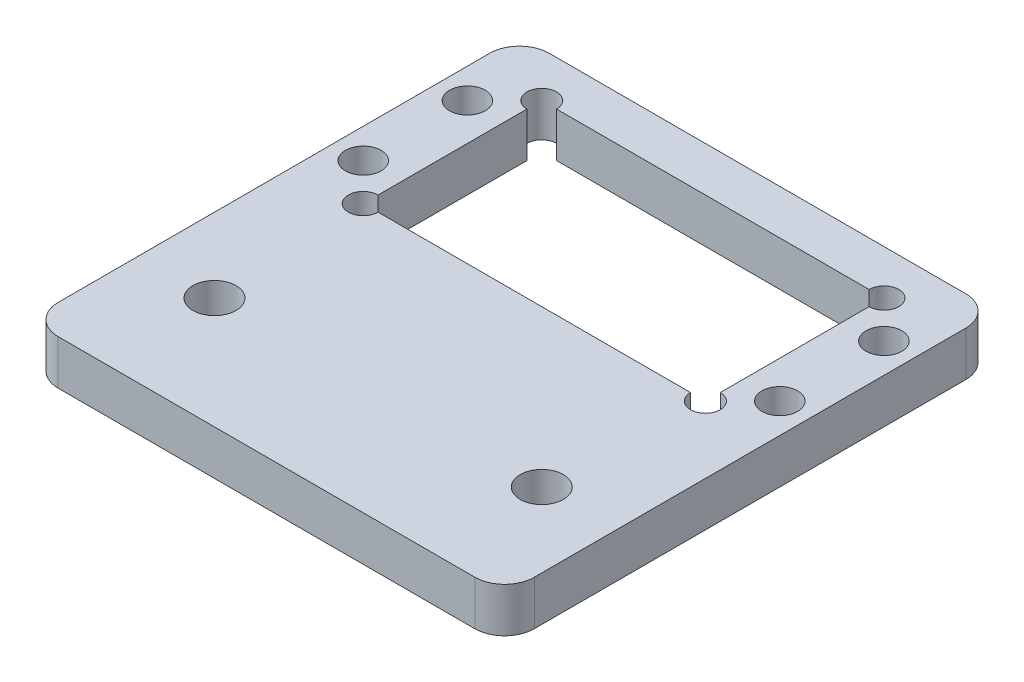
ISO-10303-21;
HEADER;
FILE_DESCRIPTION(('STEP AP214'),'2;1');
FILE_NAME('part.step','',(''),(''),'','','');
FILE_SCHEMA(('AUTOMOTIVE_DESIGN { 1 0 10303 214 1 1 1 1 }'));
ENDSEC;
DATA;
#1=APPLICATION_CONTEXT('core data for automotive mechanical design processes');
#2=APPLICATION_PROTOCOL_DEFINITION('international standard','automotive_design',2000,#1);
#3=PRODUCT_CONTEXT('',#1,'mechanical');
#4=PRODUCT('Part','Part','',(#3));
#5=PRODUCT_RELATED_PRODUCT_CATEGORY('part','',(#4));
#6=PRODUCT_DEFINITION_FORMATION('','',#4);
#7=PRODUCT_DEFINITION_CONTEXT('part definition',#1,'design');
#8=PRODUCT_DEFINITION('design','',#6,#7);
#9=PRODUCT_DEFINITION_SHAPE('','',#8);
#10=(LENGTH_UNIT() NAMED_UNIT(*) SI_UNIT(.MILLI.,.METRE.));
#11=(NAMED_UNIT(*) PLANE_ANGLE_UNIT() SI_UNIT($,.RADIAN.));
#12=(NAMED_UNIT(*) SI_UNIT($,.STERADIAN.) SOLID_ANGLE_UNIT());
#13=UNCERTAINTY_MEASURE_WITH_UNIT(LENGTH_MEASURE(1.E-05),#10,'distance_accuracy_value','');
#14=(GEOMETRIC_REPRESENTATION_CONTEXT(3) GLOBAL_UNCERTAINTY_ASSIGNED_CONTEXT((#13)) GLOBAL_UNIT_ASSIGNED_CONTEXT((#10,
#11,#12)) REPRESENTATION_CONTEXT('',''));
#15=CARTESIAN_POINT('',(0.,0.,0.));
#16=DIRECTION('',(0.,0.,1.));
#17=DIRECTION('',(1.,0.,0.));
#18=AXIS2_PLACEMENT_3D('',#15,#16,#17);
#19=CARTESIAN_POINT('',(0.,3.,0.));
#20=DIRECTION('',(0.,-1.,0.));
#21=DIRECTION('',(0.,0.,-1.));
#22=AXIS2_PLACEMENT_3D('',#19,#20,#21);
#23=PLANE('',#22);
#24=CARTESIAN_POINT('',(14.,3.,3.5));
#25=DIRECTION('',(0.,1.,0.));
#26=DIRECTION('',(0.,0.,1.));
#27=AXIS2_PLACEMENT_3D('',#24,#25,#26);
#28=CIRCLE('',#27,1.2);
#29=CARTESIAN_POINT('',(14.,3.,4.7));
#30=VERTEX_POINT('',#29);
#31=EDGE_CURVE('E214',#30,#30,#28,.T.);
#32=ORIENTED_EDGE('',*,*,#31,.F.);
#33=EDGE_LOOP('',(#32));
#34=FACE_BOUND('',#33,.T.);
#35=CARTESIAN_POINT('',(14.,3.,-3.5));
#36=DIRECTION('',(0.,1.,0.));
#37=DIRECTION('',(0.,0.,1.));
#38=AXIS2_PLACEMENT_3D('',#35,#36,#37);
#39=CIRCLE('',#38,1.2);
#40=CARTESIAN_POINT('',(14.,3.,-2.3));
#41=VERTEX_POINT('',#40);
#42=EDGE_CURVE('E222',#41,#41,#39,.T.);
#43=ORIENTED_EDGE('',*,*,#42,.F.);
#44=EDGE_LOOP('',(#43));
#45=FACE_BOUND('',#44,.T.);
#46=CARTESIAN_POINT('',(-14.,3.,3.5));
#47=DIRECTION('',(0.,1.,0.));
#48=DIRECTION('',(0.,0.,1.));
#49=AXIS2_PLACEMENT_3D('',#46,#47,#48);
#50=CIRCLE('',#49,1.2);
#51=CARTESIAN_POINT('',(-14.,3.,4.7));
#52=VERTEX_POINT('',#51);
#53=EDGE_CURVE('E230',#52,#52,#50,.T.);
#54=ORIENTED_EDGE('',*,*,#53,.F.);
#55=EDGE_LOOP('',(#54));
#56=FACE_BOUND('',#55,.T.);
#57=CARTESIAN_POINT('',(-14.,3.,-3.5));
#58=DIRECTION('',(0.,1.,0.));
#59=DIRECTION('',(0.,0.,1.));
#60=AXIS2_PLACEMENT_3D('',#57,#58,#59);
#61=CIRCLE('',#60,1.2);
#62=CARTESIAN_POINT('',(-14.,3.,-2.3));
#63=VERTEX_POINT('',#62);
#64=EDGE_CURVE('E238',#63,#63,#61,.T.);
#65=ORIENTED_EDGE('',*,*,#64,.F.);
#66=EDGE_LOOP('',(#65));
#67=FACE_BOUND('',#66,.T.);
#68=DIRECTION('',(0.,0.,-1.));
#69=VECTOR('',#68,1.);
#70=CARTESIAN_POINT('',(16.,3.,9.));
#71=LINE('',#70,#69);
#72=CARTESIAN_POINT('',(16.,3.,22.));
#73=VERTEX_POINT('',#72);
#74=CARTESIAN_POINT('',(16.,3.,-7.));
#75=VERTEX_POINT('',#74);
#76=EDGE_CURVE('E246',#73,#75,#71,.T.);
#77=ORIENTED_EDGE('',*,*,#76,.T.);
#78=CARTESIAN_POINT('',(14.,3.,-7.));
#79=DIRECTION('',(0.,-1.,0.));
#80=DIRECTION('',(0.,0.,-1.));
#81=AXIS2_PLACEMENT_3D('',#78,#79,#80);
#82=CIRCLE('',#81,2.);
#83=CARTESIAN_POINT('',(14.,3.,-9.));
#84=VERTEX_POINT('',#83);
#85=EDGE_CURVE('E300',#75,#84,#82,.F.);
#86=ORIENTED_EDGE('',*,*,#85,.T.);
#87=DIRECTION('',(-1.,0.,0.));
#88=VECTOR('',#87,1.);
#89=CARTESIAN_POINT('',(-16.,3.,-9.));
#90=LINE('',#89,#88);
#91=CARTESIAN_POINT('',(-14.,3.,-9.));
#92=VERTEX_POINT('',#91);
#93=EDGE_CURVE('E250',#84,#92,#90,.T.);
#94=ORIENTED_EDGE('',*,*,#93,.T.);
#95=CARTESIAN_POINT('',(-14.,3.,-7.));
#96=DIRECTION('',(0.,-1.,0.));
#97=DIRECTION('',(0.,0.,-1.));
#98=AXIS2_PLACEMENT_3D('',#95,#96,#97);
#99=CIRCLE('',#98,2.);
#100=CARTESIAN_POINT('',(-16.,3.,-7.));
#101=VERTEX_POINT('',#100);
#102=EDGE_CURVE('E297',#92,#101,#99,.F.);
#103=ORIENTED_EDGE('',*,*,#102,.T.);
#104=DIRECTION('',(0.,0.,1.));
#105=VECTOR('',#104,1.);
#106=CARTESIAN_POINT('',(-16.,3.,9.));
#107=LINE('',#106,#105);
#108=CARTESIAN_POINT('',(-16.,3.,22.));
#109=VERTEX_POINT('',#108);
#110=EDGE_CURVE('E255',#101,#109,#107,.T.);
#111=ORIENTED_EDGE('',*,*,#110,.T.);
#112=CARTESIAN_POINT('',(-14.,3.,22.));
#113=DIRECTION('',(0.,-1.,0.));
#114=DIRECTION('',(0.,0.,-1.));
#115=AXIS2_PLACEMENT_3D('',#112,#113,#114);
#116=CIRCLE('',#115,2.);
#117=CARTESIAN_POINT('',(-14.,3.,24.));
#118=VERTEX_POINT('',#117);
#119=EDGE_CURVE('E67',#109,#118,#116,.F.);
#120=ORIENTED_EDGE('',*,*,#119,.T.);
#121=DIRECTION('',(1.,0.,0.));
#122=VECTOR('',#121,1.);
#123=CARTESIAN_POINT('',(-16.,3.,24.));
#124=LINE('',#123,#122);
#125=CARTESIAN_POINT('',(14.,3.,24.));
#126=VERTEX_POINT('',#125);
#127=EDGE_CURVE('E314',#118,#126,#124,.T.);
#128=ORIENTED_EDGE('',*,*,#127,.T.);
#129=CARTESIAN_POINT('',(14.,3.,22.));
#130=DIRECTION('',(0.,-1.,0.));
#131=DIRECTION('',(0.,0.,-1.));
#132=AXIS2_PLACEMENT_3D('',#129,#130,#131);
#133=CIRCLE('',#132,2.);
#134=EDGE_CURVE('E59',#126,#73,#133,.F.);
#135=ORIENTED_EDGE('',*,*,#134,.T.);
#136=EDGE_LOOP('',(#77,#86,#94,#103,#111,#120,#128,#135));
#137=FACE_BOUND('',#136,.T.);
#138=DIRECTION('',(-1.,0.,0.));
#139=VECTOR('',#138,1.);
#140=CARTESIAN_POINT('',(-11.5,3.,-6.));
#141=LINE('',#140,#139);
#142=CARTESIAN_POINT('',(10.5,3.,-6.));
#143=VERTEX_POINT('',#142);
#144=CARTESIAN_POINT('',(-10.5,3.,-6.));
#145=VERTEX_POINT('',#144);
#146=EDGE_CURVE('E187',#143,#145,#141,.T.);
#147=ORIENTED_EDGE('',*,*,#146,.F.);
#148=CARTESIAN_POINT('',(11.5,3.,-6.));
#149=DIRECTION('',(0.,1.,0.));
#150=DIRECTION('',(0.,0.,1.));
#151=AXIS2_PLACEMENT_3D('',#148,#149,#150);
#152=CIRCLE('',#151,1.);
#153=CARTESIAN_POINT('',(11.5,3.,-5.));
#154=VERTEX_POINT('',#153);
#155=EDGE_CURVE('E355',#154,#143,#152,.T.);
#156=ORIENTED_EDGE('',*,*,#155,.F.);
#157=DIRECTION('',(0.,0.,-1.));
#158=VECTOR('',#157,1.);
#159=CARTESIAN_POINT('',(11.5,3.,6.));
#160=LINE('',#159,#158);
#161=CARTESIAN_POINT('',(11.5,3.,5.));
#162=VERTEX_POINT('',#161);
#163=EDGE_CURVE('E194',#162,#154,#160,.T.);
#164=ORIENTED_EDGE('',*,*,#163,.F.);
#165=CARTESIAN_POINT('',(11.5,3.,6.));
#166=DIRECTION('',(0.,1.,0.));
#167=DIRECTION('',(0.,0.,1.));
#168=AXIS2_PLACEMENT_3D('',#165,#166,#167);
#169=CIRCLE('',#168,1.);
#170=CARTESIAN_POINT('',(10.5,3.,6.));
#171=VERTEX_POINT('',#170);
#172=EDGE_CURVE('E341',#171,#162,#169,.T.);
#173=ORIENTED_EDGE('',*,*,#172,.F.);
#174=DIRECTION('',(1.,0.,0.));
#175=VECTOR('',#174,1.);
#176=CARTESIAN_POINT('',(-11.5,3.,6.));
#177=LINE('',#176,#175);
#178=CARTESIAN_POINT('',(-10.5,3.,6.));
#179=VERTEX_POINT('',#178);
#180=EDGE_CURVE('E180',#179,#171,#177,.T.);
#181=ORIENTED_EDGE('',*,*,#180,.F.);
#182=CARTESIAN_POINT('',(-11.5,3.,6.));
#183=DIRECTION('',(0.,1.,0.));
#184=DIRECTION('',(0.,0.,1.));
#185=AXIS2_PLACEMENT_3D('',#182,#183,#184);
#186=CIRCLE('',#185,1.);
#187=CARTESIAN_POINT('',(-11.5,3.,5.));
#188=VERTEX_POINT('',#187);
#189=EDGE_CURVE('E160',#188,#179,#186,.T.);
#190=ORIENTED_EDGE('',*,*,#189,.F.);
#191=DIRECTION('',(0.,0.,1.));
#192=VECTOR('',#191,1.);
#193=CARTESIAN_POINT('',(-11.5,3.,6.));
#194=LINE('',#193,#192);
#195=CARTESIAN_POINT('',(-11.5,3.,-5.));
#196=VERTEX_POINT('',#195);
#197=EDGE_CURVE('E177',#196,#188,#194,.T.);
#198=ORIENTED_EDGE('',*,*,#197,.F.);
#199=CARTESIAN_POINT('',(-11.5,3.,-6.));
#200=DIRECTION('',(0.,1.,0.));
#201=DIRECTION('',(0.,0.,1.));
#202=AXIS2_PLACEMENT_3D('',#199,#200,#201);
#203=CIRCLE('',#202,1.);
#204=EDGE_CURVE('E371',#145,#196,#203,.T.);
#205=ORIENTED_EDGE('',*,*,#204,.F.);
#206=EDGE_LOOP('',(#147,#156,#164,#173,#181,#190,#198,#205));
#207=FACE_BOUND('',#206,.T.);
#208=CARTESIAN_POINT('',(11.,3.,16.5));
#209=DIRECTION('',(0.,1.,0.));
#210=DIRECTION('',(0.,0.,1.));
#211=AXIS2_PLACEMENT_3D('',#208,#209,#210);
#212=CIRCLE('',#211,1.45);
#213=CARTESIAN_POINT('',(11.,3.,17.95));
#214=VERTEX_POINT('',#213);
#215=EDGE_CURVE('E479',#214,#214,#212,.T.);
#216=ORIENTED_EDGE('',*,*,#215,.F.);
#217=EDGE_LOOP('',(#216));
#218=FACE_BOUND('',#217,.T.);
#219=CARTESIAN_POINT('',(-11.,3.,16.5));
#220=DIRECTION('',(0.,1.,0.));
#221=DIRECTION('',(0.,0.,1.));
#222=AXIS2_PLACEMENT_3D('',#219,#220,#221);
#223=CIRCLE('',#222,1.45);
#224=CARTESIAN_POINT('',(-11.,3.,17.95));
#225=VERTEX_POINT('',#224);
#226=EDGE_CURVE('E328',#225,#225,#223,.T.);
#227=ORIENTED_EDGE('',*,*,#226,.F.);
#228=EDGE_LOOP('',(#227));
#229=FACE_BOUND('',#228,.T.);
#230=ADVANCED_FACE('F43',(#34,#45,#56,#67,#137,#207,#218,#229),#23,.F.);
#231=CARTESIAN_POINT('',(0.,0.,0.));
#232=DIRECTION('',(0.,-1.,0.));
#233=DIRECTION('',(0.,0.,-1.));
#234=AXIS2_PLACEMENT_3D('',#231,#232,#233);
#235=PLANE('',#234);
#236=CARTESIAN_POINT('',(11.5,0.,-6.));
#237=DIRECTION('',(0.,-1.,0.));
#238=DIRECTION('',(0.,0.,-1.));
#239=AXIS2_PLACEMENT_3D('',#236,#237,#238);
#240=CIRCLE('',#239,1.);
#241=CARTESIAN_POINT('',(11.5,0.,-5.));
#242=VERTEX_POINT('',#241);
#243=CARTESIAN_POINT('',(10.5,0.,-6.));
#244=VERTEX_POINT('',#243);
#245=EDGE_CURVE('E325',#242,#244,#240,.F.);
#246=ORIENTED_EDGE('',*,*,#245,.T.);
#247=DIRECTION('',(-1.,0.,0.));
#248=VECTOR('',#247,1.);
#249=CARTESIAN_POINT('',(-11.5,0.,-6.));
#250=LINE('',#249,#248);
#251=CARTESIAN_POINT('',(-10.5,0.,-6.));
#252=VERTEX_POINT('',#251);
#253=EDGE_CURVE('E202',#244,#252,#250,.T.);
#254=ORIENTED_EDGE('',*,*,#253,.T.);
#255=CARTESIAN_POINT('',(-11.5,0.,-6.));
#256=DIRECTION('',(0.,-1.,0.));
#257=DIRECTION('',(0.,0.,-1.));
#258=AXIS2_PLACEMENT_3D('',#255,#256,#257);
#259=CIRCLE('',#258,1.);
#260=CARTESIAN_POINT('',(-11.5,0.,-5.));
#261=VERTEX_POINT('',#260);
#262=EDGE_CURVE('E203',#252,#261,#259,.F.);
#263=ORIENTED_EDGE('',*,*,#262,.T.);
#264=DIRECTION('',(0.,0.,1.));
#265=VECTOR('',#264,1.);
#266=CARTESIAN_POINT('',(-11.5,0.,6.));
#267=LINE('',#266,#265);
#268=CARTESIAN_POINT('',(-11.5,0.,5.));
#269=VERTEX_POINT('',#268);
#270=EDGE_CURVE('E207',#261,#269,#267,.T.);
#271=ORIENTED_EDGE('',*,*,#270,.T.);
#272=CARTESIAN_POINT('',(-11.5,0.,6.));
#273=DIRECTION('',(0.,-1.,0.));
#274=DIRECTION('',(0.,0.,-1.));
#275=AXIS2_PLACEMENT_3D('',#272,#273,#274);
#276=CIRCLE('',#275,1.);
#277=CARTESIAN_POINT('',(-10.5,0.,6.));
#278=VERTEX_POINT('',#277);
#279=EDGE_CURVE('E163',#269,#278,#276,.F.);
#280=ORIENTED_EDGE('',*,*,#279,.T.);
#281=DIRECTION('',(1.,0.,0.));
#282=VECTOR('',#281,1.);
#283=CARTESIAN_POINT('',(-11.5,0.,6.));
#284=LINE('',#283,#282);
#285=CARTESIAN_POINT('',(10.5,0.,6.));
#286=VERTEX_POINT('',#285);
#287=EDGE_CURVE('E210',#278,#286,#284,.T.);
#288=ORIENTED_EDGE('',*,*,#287,.T.);
#289=CARTESIAN_POINT('',(11.5,0.,6.));
#290=DIRECTION('',(0.,-1.,0.));
#291=DIRECTION('',(0.,0.,-1.));
#292=AXIS2_PLACEMENT_3D('',#289,#290,#291);
#293=CIRCLE('',#292,1.);
#294=CARTESIAN_POINT('',(11.5,0.,5.));
#295=VERTEX_POINT('',#294);
#296=EDGE_CURVE('E337',#286,#295,#293,.F.);
#297=ORIENTED_EDGE('',*,*,#296,.T.);
#298=DIRECTION('',(0.,0.,-1.));
#299=VECTOR('',#298,1.);
#300=CARTESIAN_POINT('',(11.5,0.,6.));
#301=LINE('',#300,#299);
#302=EDGE_CURVE('E198',#295,#242,#301,.T.);
#303=ORIENTED_EDGE('',*,*,#302,.T.);
#304=EDGE_LOOP('',(#246,#254,#263,#271,#280,#288,#297,#303));
#305=FACE_BOUND('',#304,.T.);
#306=CARTESIAN_POINT('',(14.,0.,-3.5));
#307=DIRECTION('',(0.,1.,0.));
#308=DIRECTION('',(0.,0.,1.));
#309=AXIS2_PLACEMENT_3D('',#306,#307,#308);
#310=CIRCLE('',#309,1.2);
#311=CARTESIAN_POINT('',(14.,0.,-2.3));
#312=VERTEX_POINT('',#311);
#313=EDGE_CURVE('E218',#312,#312,#310,.T.);
#314=ORIENTED_EDGE('',*,*,#313,.T.);
#315=EDGE_LOOP('',(#314));
#316=FACE_BOUND('',#315,.T.);
#317=CARTESIAN_POINT('',(-14.,0.,-3.5));
#318=DIRECTION('',(0.,1.,0.));
#319=DIRECTION('',(0.,0.,1.));
#320=AXIS2_PLACEMENT_3D('',#317,#318,#319);
#321=CIRCLE('',#320,1.2);
#322=CARTESIAN_POINT('',(-14.,0.,-2.3));
#323=VERTEX_POINT('',#322);
#324=EDGE_CURVE('E234',#323,#323,#321,.T.);
#325=ORIENTED_EDGE('',*,*,#324,.T.);
#326=EDGE_LOOP('',(#325));
#327=FACE_BOUND('',#326,.T.);
#328=DIRECTION('',(-1.,0.,0.));
#329=VECTOR('',#328,1.);
#330=CARTESIAN_POINT('',(-16.,0.,-9.));
#331=LINE('',#330,#329);
#332=CARTESIAN_POINT('',(14.,0.,-9.));
#333=VERTEX_POINT('',#332);
#334=CARTESIAN_POINT('',(-14.,0.,-9.));
#335=VERTEX_POINT('',#334);
#336=EDGE_CURVE('E262',#333,#335,#331,.T.);
#337=ORIENTED_EDGE('',*,*,#336,.F.);
#338=CARTESIAN_POINT('',(14.,0.,-7.));
#339=DIRECTION('',(0.,-1.,0.));
#340=DIRECTION('',(0.,0.,-1.));
#341=AXIS2_PLACEMENT_3D('',#338,#339,#340);
#342=CIRCLE('',#341,2.);
#343=CARTESIAN_POINT('',(16.,0.,-7.));
#344=VERTEX_POINT('',#343);
#345=EDGE_CURVE('E284',#333,#344,#342,.T.);
#346=ORIENTED_EDGE('',*,*,#345,.T.);
#347=DIRECTION('',(0.,0.,-1.));
#348=VECTOR('',#347,1.);
#349=CARTESIAN_POINT('',(16.,0.,9.));
#350=LINE('',#349,#348);
#351=CARTESIAN_POINT('',(16.,0.,22.));
#352=VERTEX_POINT('',#351);
#353=EDGE_CURVE('E242',#352,#344,#350,.T.);
#354=ORIENTED_EDGE('',*,*,#353,.F.);
#355=CARTESIAN_POINT('',(14.,0.,22.));
#356=DIRECTION('',(0.,-1.,0.));
#357=DIRECTION('',(0.,0.,-1.));
#358=AXIS2_PLACEMENT_3D('',#355,#356,#357);
#359=CIRCLE('',#358,2.);
#360=CARTESIAN_POINT('',(14.,0.,24.));
#361=VERTEX_POINT('',#360);
#362=EDGE_CURVE('E275',#352,#361,#359,.T.);
#363=ORIENTED_EDGE('',*,*,#362,.T.);
#364=DIRECTION('',(1.,0.,0.));
#365=VECTOR('',#364,1.);
#366=CARTESIAN_POINT('',(-16.,0.,24.));
#367=LINE('',#366,#365);
#368=CARTESIAN_POINT('',(-14.,0.,24.));
#369=VERTEX_POINT('',#368);
#370=EDGE_CURVE('E317',#369,#361,#367,.T.);
#371=ORIENTED_EDGE('',*,*,#370,.F.);
#372=CARTESIAN_POINT('',(-14.,0.,22.));
#373=DIRECTION('',(0.,-1.,0.));
#374=DIRECTION('',(0.,0.,-1.));
#375=AXIS2_PLACEMENT_3D('',#372,#373,#374);
#376=CIRCLE('',#375,2.);
#377=CARTESIAN_POINT('',(-16.,0.,22.));
#378=VERTEX_POINT('',#377);
#379=EDGE_CURVE('E278',#369,#378,#376,.T.);
#380=ORIENTED_EDGE('',*,*,#379,.T.);
#381=DIRECTION('',(0.,0.,1.));
#382=VECTOR('',#381,1.);
#383=CARTESIAN_POINT('',(-16.,0.,9.));
#384=LINE('',#383,#382);
#385=CARTESIAN_POINT('',(-16.,0.,-7.));
#386=VERTEX_POINT('',#385);
#387=EDGE_CURVE('E251',#386,#378,#384,.T.);
#388=ORIENTED_EDGE('',*,*,#387,.F.);
#389=CARTESIAN_POINT('',(-14.,0.,-7.));
#390=DIRECTION('',(0.,-1.,0.));
#391=DIRECTION('',(0.,0.,-1.));
#392=AXIS2_PLACEMENT_3D('',#389,#390,#391);
#393=CIRCLE('',#392,2.);
#394=EDGE_CURVE('E281',#386,#335,#393,.T.);
#395=ORIENTED_EDGE('',*,*,#394,.T.);
#396=EDGE_LOOP('',(#337,#346,#354,#363,#371,#380,#388,#395));
#397=FACE_BOUND('',#396,.T.);
#398=CARTESIAN_POINT('',(-14.,0.,3.5));
#399=DIRECTION('',(0.,1.,0.));
#400=DIRECTION('',(0.,0.,1.));
#401=AXIS2_PLACEMENT_3D('',#398,#399,#400);
#402=CIRCLE('',#401,1.2);
#403=CARTESIAN_POINT('',(-14.,0.,4.7));
#404=VERTEX_POINT('',#403);
#405=EDGE_CURVE('E226',#404,#404,#402,.T.);
#406=ORIENTED_EDGE('',*,*,#405,.T.);
#407=EDGE_LOOP('',(#406));
#408=FACE_BOUND('',#407,.T.);
#409=CARTESIAN_POINT('',(14.,0.,3.5));
#410=DIRECTION('',(0.,1.,0.));
#411=DIRECTION('',(0.,0.,1.));
#412=AXIS2_PLACEMENT_3D('',#409,#410,#411);
#413=CIRCLE('',#412,1.2);
#414=CARTESIAN_POINT('',(14.,0.,4.7));
#415=VERTEX_POINT('',#414);
#416=EDGE_CURVE('E191',#415,#415,#413,.T.);
#417=ORIENTED_EDGE('',*,*,#416,.T.);
#418=EDGE_LOOP('',(#417));
#419=FACE_BOUND('',#418,.T.);
#420=CARTESIAN_POINT('',(11.,0.,16.5));
#421=DIRECTION('',(0.,1.,0.));
#422=DIRECTION('',(0.,0.,1.));
#423=AXIS2_PLACEMENT_3D('',#420,#421,#422);
#424=CIRCLE('',#423,1.45);
#425=CARTESIAN_POINT('',(11.,0.,17.95));
#426=VERTEX_POINT('',#425);
#427=EDGE_CURVE('E467',#426,#426,#424,.T.);
#428=ORIENTED_EDGE('',*,*,#427,.T.);
#429=EDGE_LOOP('',(#428));
#430=FACE_BOUND('',#429,.T.);
#431=CARTESIAN_POINT('',(-11.,0.,16.5));
#432=DIRECTION('',(0.,1.,0.));
#433=DIRECTION('',(0.,0.,1.));
#434=AXIS2_PLACEMENT_3D('',#431,#432,#433);
#435=CIRCLE('',#434,1.45);
#436=CARTESIAN_POINT('',(-11.,0.,17.95));
#437=VERTEX_POINT('',#436);
#438=EDGE_CURVE('E321',#437,#437,#435,.T.);
#439=ORIENTED_EDGE('',*,*,#438,.T.);
#440=EDGE_LOOP('',(#439));
#441=FACE_BOUND('',#440,.T.);
#442=ADVANCED_FACE('F389',(#305,#316,#327,#397,#408,#419,#430,#441),#235,.T.);
#443=CARTESIAN_POINT('',(16.,3.,9.));
#444=DIRECTION('',(-1.,0.,0.));
#445=DIRECTION('',(0.,0.,1.));
#446=AXIS2_PLACEMENT_3D('',#443,#444,#445);
#447=PLANE('',#446);
#448=ORIENTED_EDGE('',*,*,#353,.T.);
#449=DIRECTION('',(0.,-1.,0.));
#450=VECTOR('',#449,1.);
#451=CARTESIAN_POINT('',(16.,3.,-7.));
#452=LINE('',#451,#450);
#453=EDGE_CURVE('E290',#344,#75,#452,.F.);
#454=ORIENTED_EDGE('',*,*,#453,.T.);
#455=ORIENTED_EDGE('',*,*,#76,.F.);
#456=DIRECTION('',(0.,1.,0.));
#457=VECTOR('',#456,1.);
#458=CARTESIAN_POINT('',(16.,0.,22.));
#459=LINE('',#458,#457);
#460=EDGE_CURVE('E287',#73,#352,#459,.F.);
#461=ORIENTED_EDGE('',*,*,#460,.T.);
#462=EDGE_LOOP('',(#448,#454,#455,#461));
#463=FACE_BOUND('',#462,.T.);
#464=ADVANCED_FACE('F412',(#463),#447,.F.);
#465=CARTESIAN_POINT('',(-16.,3.,-9.));
#466=DIRECTION('',(0.,0.,1.));
#467=DIRECTION('',(1.,0.,0.));
#468=AXIS2_PLACEMENT_3D('',#465,#466,#467);
#469=PLANE('',#468);
#470=ORIENTED_EDGE('',*,*,#93,.F.);
#471=DIRECTION('',(0.,-1.,0.));
#472=VECTOR('',#471,1.);
#473=CARTESIAN_POINT('',(14.,3.,-9.));
#474=LINE('',#473,#472);
#475=EDGE_CURVE('E271',#84,#333,#474,.T.);
#476=ORIENTED_EDGE('',*,*,#475,.T.);
#477=ORIENTED_EDGE('',*,*,#336,.T.);
#478=DIRECTION('',(0.,-1.,0.));
#479=VECTOR('',#478,1.);
#480=CARTESIAN_POINT('',(-14.,3.,-9.));
#481=LINE('',#480,#479);
#482=EDGE_CURVE('E258',#335,#92,#481,.F.);
#483=ORIENTED_EDGE('',*,*,#482,.T.);
#484=EDGE_LOOP('',(#470,#476,#477,#483));
#485=FACE_BOUND('',#484,.T.);
#486=ADVANCED_FACE('F423',(#485),#469,.F.);
#487=CARTESIAN_POINT('',(-16.,3.,9.));
#488=DIRECTION('',(1.,0.,0.));
#489=DIRECTION('',(0.,0.,-1.));
#490=AXIS2_PLACEMENT_3D('',#487,#488,#489);
#491=PLANE('',#490);
#492=ORIENTED_EDGE('',*,*,#110,.F.);
#493=DIRECTION('',(0.,-1.,0.));
#494=VECTOR('',#493,1.);
#495=CARTESIAN_POINT('',(-16.,3.,-7.));
#496=LINE('',#495,#494);
#497=EDGE_CURVE('E307',#101,#386,#496,.T.);
#498=ORIENTED_EDGE('',*,*,#497,.T.);
#499=ORIENTED_EDGE('',*,*,#387,.T.);
#500=DIRECTION('',(0.,1.,0.));
#501=VECTOR('',#500,1.);
#502=CARTESIAN_POINT('',(-16.,3.,22.));
#503=LINE('',#502,#501);
#504=EDGE_CURVE('E303',#378,#109,#503,.T.);
#505=ORIENTED_EDGE('',*,*,#504,.T.);
#506=EDGE_LOOP('',(#492,#498,#499,#505));
#507=FACE_BOUND('',#506,.T.);
#508=ADVANCED_FACE('F420',(#507),#491,.F.);
#509=CARTESIAN_POINT('',(-14.,3.,-3.5));
#510=DIRECTION('',(0.,-1.,0.));
#511=DIRECTION('',(0.,0.,-1.));
#512=AXIS2_PLACEMENT_3D('',#509,#510,#511);
#513=CYLINDRICAL_SURFACE('',#512,1.2);
#514=ORIENTED_EDGE('',*,*,#64,.T.);
#515=EDGE_LOOP('',(#514));
#516=FACE_BOUND('',#515,.T.);
#517=ORIENTED_EDGE('',*,*,#324,.F.);
#518=EDGE_LOOP('',(#517));
#519=FACE_BOUND('',#518,.T.);
#520=ADVANCED_FACE('F417',(#516,#519),#513,.F.);
#521=CARTESIAN_POINT('',(-14.,3.,3.5));
#522=DIRECTION('',(0.,-1.,0.));
#523=DIRECTION('',(0.,0.,-1.));
#524=AXIS2_PLACEMENT_3D('',#521,#522,#523);
#525=CYLINDRICAL_SURFACE('',#524,1.2);
#526=ORIENTED_EDGE('',*,*,#53,.T.);
#527=EDGE_LOOP('',(#526));
#528=FACE_BOUND('',#527,.T.);
#529=ORIENTED_EDGE('',*,*,#405,.F.);
#530=EDGE_LOOP('',(#529));
#531=FACE_BOUND('',#530,.T.);
#532=ADVANCED_FACE('F593',(#528,#531),#525,.F.);
#533=CARTESIAN_POINT('',(14.,3.,-3.5));
#534=DIRECTION('',(0.,-1.,0.));
#535=DIRECTION('',(0.,0.,-1.));
#536=AXIS2_PLACEMENT_3D('',#533,#534,#535);
#537=CYLINDRICAL_SURFACE('',#536,1.2);
#538=ORIENTED_EDGE('',*,*,#42,.T.);
#539=EDGE_LOOP('',(#538));
#540=FACE_BOUND('',#539,.T.);
#541=ORIENTED_EDGE('',*,*,#313,.F.);
#542=EDGE_LOOP('',(#541));
#543=FACE_BOUND('',#542,.T.);
#544=ADVANCED_FACE('F601',(#540,#543),#537,.F.);
#545=CARTESIAN_POINT('',(14.,3.,3.5));
#546=DIRECTION('',(0.,-1.,0.));
#547=DIRECTION('',(0.,0.,-1.));
#548=AXIS2_PLACEMENT_3D('',#545,#546,#547);
#549=CYLINDRICAL_SURFACE('',#548,1.2);
#550=ORIENTED_EDGE('',*,*,#31,.T.);
#551=EDGE_LOOP('',(#550));
#552=FACE_BOUND('',#551,.T.);
#553=ORIENTED_EDGE('',*,*,#416,.F.);
#554=EDGE_LOOP('',(#553));
#555=FACE_BOUND('',#554,.T.);
#556=ADVANCED_FACE('F609',(#552,#555),#549,.F.);
#557=CARTESIAN_POINT('',(11.5,3.,6.));
#558=DIRECTION('',(-1.,0.,0.));
#559=DIRECTION('',(0.,0.,1.));
#560=AXIS2_PLACEMENT_3D('',#557,#558,#559);
#561=PLANE('',#560);
#562=DIRECTION('',(0.,1.,0.));
#563=VECTOR('',#562,1.);
#564=CARTESIAN_POINT('',(11.5,-0.00100000000000013,-5.));
#565=LINE('',#564,#563);
#566=EDGE_CURVE('E358',#154,#242,#565,.F.);
#567=ORIENTED_EDGE('',*,*,#566,.T.);
#568=ORIENTED_EDGE('',*,*,#302,.F.);
#569=DIRECTION('',(0.,1.,0.));
#570=VECTOR('',#569,1.);
#571=CARTESIAN_POINT('',(11.5,-0.00100000000000013,5.));
#572=LINE('',#571,#570);
#573=EDGE_CURVE('E345',#295,#162,#572,.T.);
#574=ORIENTED_EDGE('',*,*,#573,.T.);
#575=ORIENTED_EDGE('',*,*,#163,.T.);
#576=EDGE_LOOP('',(#567,#568,#574,#575));
#577=FACE_BOUND('',#576,.T.);
#578=ADVANCED_FACE('F380',(#577),#561,.T.);
#579=CARTESIAN_POINT('',(-11.5,3.,-6.));
#580=DIRECTION('',(0.,0.,1.));
#581=DIRECTION('',(1.,0.,0.));
#582=AXIS2_PLACEMENT_3D('',#579,#580,#581);
#583=PLANE('',#582);
#584=DIRECTION('',(0.,1.,0.));
#585=VECTOR('',#584,1.);
#586=CARTESIAN_POINT('',(10.5,-0.00100000000000013,-6.));
#587=LINE('',#586,#585);
#588=EDGE_CURVE('E342',#244,#143,#587,.T.);
#589=ORIENTED_EDGE('',*,*,#588,.T.);
#590=ORIENTED_EDGE('',*,*,#146,.T.);
#591=DIRECTION('',(0.,1.,0.));
#592=VECTOR('',#591,1.);
#593=CARTESIAN_POINT('',(-10.5,-0.00100000000000013,-6.));
#594=LINE('',#593,#592);
#595=EDGE_CURVE('E367',#145,#252,#594,.F.);
#596=ORIENTED_EDGE('',*,*,#595,.T.);
#597=ORIENTED_EDGE('',*,*,#253,.F.);
#598=EDGE_LOOP('',(#589,#590,#596,#597));
#599=FACE_BOUND('',#598,.T.);
#600=ADVANCED_FACE('F387',(#599),#583,.T.);
#601=CARTESIAN_POINT('',(-11.5,3.,6.));
#602=DIRECTION('',(1.,0.,0.));
#603=DIRECTION('',(0.,0.,-1.));
#604=AXIS2_PLACEMENT_3D('',#601,#602,#603);
#605=PLANE('',#604);
#606=DIRECTION('',(0.,1.,0.));
#607=VECTOR('',#606,1.);
#608=CARTESIAN_POINT('',(-11.5,-0.00100000000000013,5.));
#609=LINE('',#608,#607);
#610=EDGE_CURVE('E157',#188,#269,#609,.F.);
#611=ORIENTED_EDGE('',*,*,#610,.T.);
#612=ORIENTED_EDGE('',*,*,#270,.F.);
#613=DIRECTION('',(0.,1.,0.));
#614=VECTOR('',#613,1.);
#615=CARTESIAN_POINT('',(-11.5,-0.00100000000000013,-5.));
#616=LINE('',#615,#614);
#617=EDGE_CURVE('E185',#261,#196,#616,.T.);
#618=ORIENTED_EDGE('',*,*,#617,.T.);
#619=ORIENTED_EDGE('',*,*,#197,.T.);
#620=EDGE_LOOP('',(#611,#612,#618,#619));
#621=FACE_BOUND('',#620,.T.);
#622=ADVANCED_FACE('F184',(#621),#605,.T.);
#623=CARTESIAN_POINT('',(-11.5,3.,6.));
#624=DIRECTION('',(0.,0.,-1.));
#625=DIRECTION('',(-1.,0.,0.));
#626=AXIS2_PLACEMENT_3D('',#623,#624,#625);
#627=PLANE('',#626);
#628=DIRECTION('',(0.,1.,0.));
#629=VECTOR('',#628,1.);
#630=CARTESIAN_POINT('',(10.5,-0.00100000000000013,6.));
#631=LINE('',#630,#629);
#632=EDGE_CURVE('E333',#171,#286,#631,.F.);
#633=ORIENTED_EDGE('',*,*,#632,.T.);
#634=ORIENTED_EDGE('',*,*,#287,.F.);
#635=DIRECTION('',(0.,1.,0.));
#636=VECTOR('',#635,1.);
#637=CARTESIAN_POINT('',(-10.5,-0.00100000000000013,6.));
#638=LINE('',#637,#636);
#639=EDGE_CURVE('E169',#278,#179,#638,.T.);
#640=ORIENTED_EDGE('',*,*,#639,.T.);
#641=ORIENTED_EDGE('',*,*,#180,.T.);
#642=EDGE_LOOP('',(#633,#634,#640,#641));
#643=FACE_BOUND('',#642,.T.);
#644=ADVANCED_FACE('F395',(#643),#627,.T.);
#645=CARTESIAN_POINT('',(-11.5,-0.00100000000000013,6.));
#646=DIRECTION('',(0.,1.,0.));
#647=DIRECTION('',(0.,0.,1.));
#648=AXIS2_PLACEMENT_3D('',#645,#646,#647);
#649=CYLINDRICAL_SURFACE('',#648,1.);
#650=ORIENTED_EDGE('',*,*,#189,.T.);
#651=ORIENTED_EDGE('',*,*,#639,.F.);
#652=ORIENTED_EDGE('',*,*,#279,.F.);
#653=ORIENTED_EDGE('',*,*,#610,.F.);
#654=EDGE_LOOP('',(#650,#651,#652,#653));
#655=FACE_BOUND('',#654,.T.);
#656=ADVANCED_FACE('F159',(#655),#649,.F.);
#657=CARTESIAN_POINT('',(11.5,-0.00100000000000013,6.));
#658=DIRECTION('',(0.,1.,0.));
#659=DIRECTION('',(0.,0.,1.));
#660=AXIS2_PLACEMENT_3D('',#657,#658,#659);
#661=CYLINDRICAL_SURFACE('',#660,1.);
#662=ORIENTED_EDGE('',*,*,#296,.F.);
#663=ORIENTED_EDGE('',*,*,#632,.F.);
#664=ORIENTED_EDGE('',*,*,#172,.T.);
#665=ORIENTED_EDGE('',*,*,#573,.F.);
#666=EDGE_LOOP('',(#662,#663,#664,#665));
#667=FACE_BOUND('',#666,.T.);
#668=ADVANCED_FACE('F393',(#667),#661,.F.);
#669=CARTESIAN_POINT('',(-11.5,-0.00100000000000013,-6.));
#670=DIRECTION('',(0.,1.,0.));
#671=DIRECTION('',(0.,0.,1.));
#672=AXIS2_PLACEMENT_3D('',#669,#670,#671);
#673=CYLINDRICAL_SURFACE('',#672,1.);
#674=ORIENTED_EDGE('',*,*,#204,.T.);
#675=ORIENTED_EDGE('',*,*,#617,.F.);
#676=ORIENTED_EDGE('',*,*,#262,.F.);
#677=ORIENTED_EDGE('',*,*,#595,.F.);
#678=EDGE_LOOP('',(#674,#675,#676,#677));
#679=FACE_BOUND('',#678,.T.);
#680=ADVANCED_FACE('F495',(#679),#673,.F.);
#681=CARTESIAN_POINT('',(11.5,-0.00100000000000013,-6.));
#682=DIRECTION('',(0.,1.,0.));
#683=DIRECTION('',(0.,0.,1.));
#684=AXIS2_PLACEMENT_3D('',#681,#682,#683);
#685=CYLINDRICAL_SURFACE('',#684,1.);
#686=ORIENTED_EDGE('',*,*,#155,.T.);
#687=ORIENTED_EDGE('',*,*,#588,.F.);
#688=ORIENTED_EDGE('',*,*,#245,.F.);
#689=ORIENTED_EDGE('',*,*,#566,.F.);
#690=EDGE_LOOP('',(#686,#687,#688,#689));
#691=FACE_BOUND('',#690,.T.);
#692=ADVANCED_FACE('F384',(#691),#685,.F.);
#693=CARTESIAN_POINT('',(-16.,0.,24.));
#694=DIRECTION('',(0.,0.,1.));
#695=DIRECTION('',(1.,0.,0.));
#696=AXIS2_PLACEMENT_3D('',#693,#694,#695);
#697=PLANE('',#696);
#698=ORIENTED_EDGE('',*,*,#127,.F.);
#699=DIRECTION('',(0.,1.,0.));
#700=VECTOR('',#699,1.);
#701=CARTESIAN_POINT('',(-14.,0.,24.));
#702=LINE('',#701,#700);
#703=EDGE_CURVE('E11',#118,#369,#702,.F.);
#704=ORIENTED_EDGE('',*,*,#703,.T.);
#705=ORIENTED_EDGE('',*,*,#370,.T.);
#706=DIRECTION('',(0.,1.,0.));
#707=VECTOR('',#706,1.);
#708=CARTESIAN_POINT('',(14.,3.,24.));
#709=LINE('',#708,#707);
#710=EDGE_CURVE('E52',#361,#126,#709,.T.);
#711=ORIENTED_EDGE('',*,*,#710,.T.);
#712=EDGE_LOOP('',(#698,#704,#705,#711));
#713=FACE_BOUND('',#712,.T.);
#714=ADVANCED_FACE('F313',(#713),#697,.T.);
#715=CARTESIAN_POINT('',(-11.,0.,16.5));
#716=DIRECTION('',(0.,1.,0.));
#717=DIRECTION('',(0.,0.,1.));
#718=AXIS2_PLACEMENT_3D('',#715,#716,#717);
#719=CYLINDRICAL_SURFACE('',#718,1.45);
#720=ORIENTED_EDGE('',*,*,#438,.F.);
#721=EDGE_LOOP('',(#720));
#722=FACE_BOUND('',#721,.T.);
#723=ORIENTED_EDGE('',*,*,#226,.T.);
#724=EDGE_LOOP('',(#723));
#725=FACE_BOUND('',#724,.T.);
#726=ADVANCED_FACE('F470',(#722,#725),#719,.F.);
#727=CARTESIAN_POINT('',(11.,0.,16.5));
#728=DIRECTION('',(0.,1.,0.));
#729=DIRECTION('',(0.,0.,1.));
#730=AXIS2_PLACEMENT_3D('',#727,#728,#729);
#731=CYLINDRICAL_SURFACE('',#730,1.45);
#732=ORIENTED_EDGE('',*,*,#427,.F.);
#733=EDGE_LOOP('',(#732));
#734=FACE_BOUND('',#733,.T.);
#735=ORIENTED_EDGE('',*,*,#215,.T.);
#736=EDGE_LOOP('',(#735));
#737=FACE_BOUND('',#736,.T.);
#738=ADVANCED_FACE('F435',(#734,#737),#731,.F.);
#739=CARTESIAN_POINT('',(14.,3.,-7.));
#740=DIRECTION('',(0.,-1.,0.));
#741=DIRECTION('',(0.,0.,-1.));
#742=AXIS2_PLACEMENT_3D('',#739,#740,#741);
#743=CYLINDRICAL_SURFACE('',#742,2.);
#744=ORIENTED_EDGE('',*,*,#85,.F.);
#745=ORIENTED_EDGE('',*,*,#453,.F.);
#746=ORIENTED_EDGE('',*,*,#345,.F.);
#747=ORIENTED_EDGE('',*,*,#475,.F.);
#748=EDGE_LOOP('',(#744,#745,#746,#747));
#749=FACE_BOUND('',#748,.T.);
#750=ADVANCED_FACE('F431',(#749),#743,.T.);
#751=CARTESIAN_POINT('',(-14.,3.,-7.));
#752=DIRECTION('',(0.,-1.,0.));
#753=DIRECTION('',(0.,0.,-1.));
#754=AXIS2_PLACEMENT_3D('',#751,#752,#753);
#755=CYLINDRICAL_SURFACE('',#754,2.);
#756=ORIENTED_EDGE('',*,*,#102,.F.);
#757=ORIENTED_EDGE('',*,*,#482,.F.);
#758=ORIENTED_EDGE('',*,*,#394,.F.);
#759=ORIENTED_EDGE('',*,*,#497,.F.);
#760=EDGE_LOOP('',(#756,#757,#758,#759));
#761=FACE_BOUND('',#760,.T.);
#762=ADVANCED_FACE('F434',(#761),#755,.T.);
#763=CARTESIAN_POINT('',(-14.,3.,22.));
#764=DIRECTION('',(0.,-1.,0.));
#765=DIRECTION('',(0.,0.,-1.));
#766=AXIS2_PLACEMENT_3D('',#763,#764,#765);
#767=CYLINDRICAL_SURFACE('',#766,2.);
#768=ORIENTED_EDGE('',*,*,#379,.F.);
#769=ORIENTED_EDGE('',*,*,#703,.F.);
#770=ORIENTED_EDGE('',*,*,#119,.F.);
#771=ORIENTED_EDGE('',*,*,#504,.F.);
#772=EDGE_LOOP('',(#768,#769,#770,#771));
#773=FACE_BOUND('',#772,.T.);
#774=ADVANCED_FACE('F438',(#773),#767,.T.);
#775=CARTESIAN_POINT('',(14.,0.,22.));
#776=DIRECTION('',(0.,-1.,0.));
#777=DIRECTION('',(0.,0.,-1.));
#778=AXIS2_PLACEMENT_3D('',#775,#776,#777);
#779=CYLINDRICAL_SURFACE('',#778,2.);
#780=ORIENTED_EDGE('',*,*,#362,.F.);
#781=ORIENTED_EDGE('',*,*,#460,.F.);
#782=ORIENTED_EDGE('',*,*,#134,.F.);
#783=ORIENTED_EDGE('',*,*,#710,.F.);
#784=EDGE_LOOP('',(#780,#781,#782,#783));
#785=FACE_BOUND('',#784,.T.);
#786=ADVANCED_FACE('F45',(#785),#779,.T.);
#787=CLOSED_SHELL('',(#230,#442,#464,#486,#508,#520,#532,#544,#556,#578,#600,#622,#644,#656,
#668,#680,#692,#714,#726,#738,#750,#762,#774,#786));
#788=MANIFOLD_SOLID_BREP('B2',#787);
#789=ADVANCED_BREP_SHAPE_REPRESENTATION('',(#18,#788),#14);
#790=SHAPE_DEFINITION_REPRESENTATION(#9,#789);
ENDSEC;
END-ISO-10303-21;
